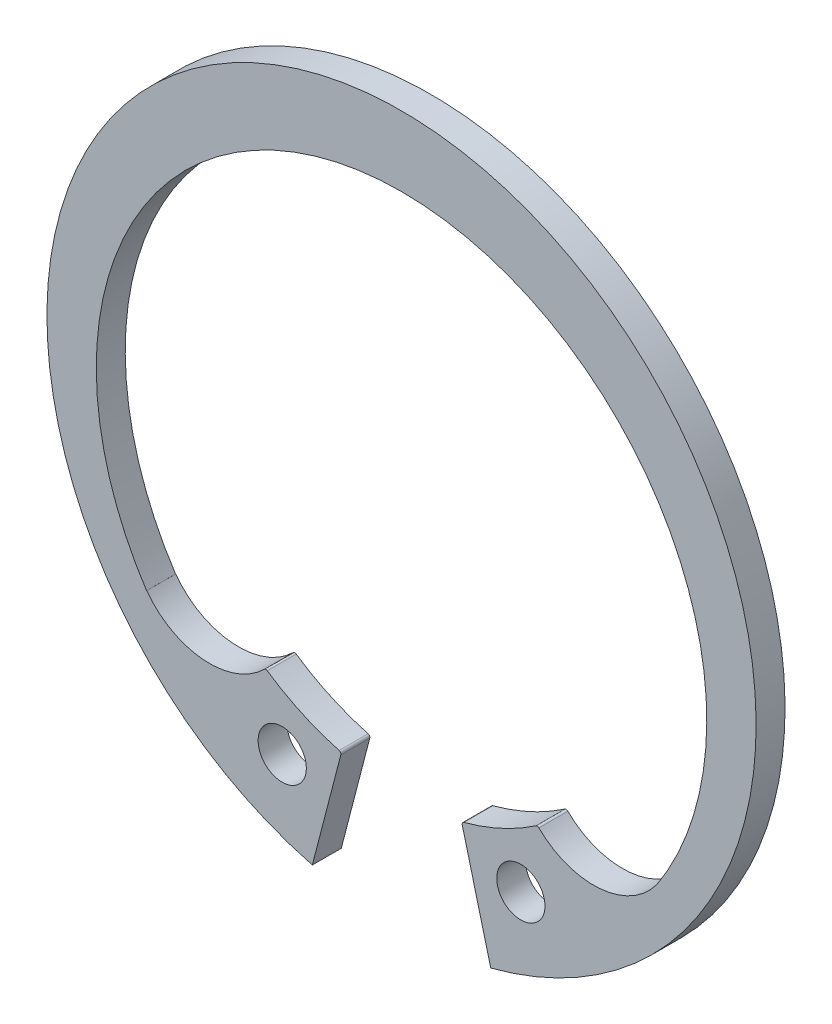
ISO-10303-21;
HEADER;
FILE_DESCRIPTION(('STEP AP214'),'2;1');
FILE_NAME('part.step','',(''),(''),'','','');
FILE_SCHEMA(('AUTOMOTIVE_DESIGN { 1 0 10303 214 1 1 1 1 }'));
ENDSEC;
DATA;
#1=APPLICATION_CONTEXT('core data for automotive mechanical design processes');
#2=APPLICATION_PROTOCOL_DEFINITION('international standard','automotive_design',2000,#1);
#3=PRODUCT_CONTEXT('',#1,'mechanical');
#4=PRODUCT('Part','Part','',(#3));
#5=PRODUCT_RELATED_PRODUCT_CATEGORY('part','',(#4));
#6=PRODUCT_DEFINITION_FORMATION('','',#4);
#7=PRODUCT_DEFINITION_CONTEXT('part definition',#1,'design');
#8=PRODUCT_DEFINITION('design','',#6,#7);
#9=PRODUCT_DEFINITION_SHAPE('','',#8);
#10=(LENGTH_UNIT() NAMED_UNIT(*) SI_UNIT(.MILLI.,.METRE.));
#11=(NAMED_UNIT(*) PLANE_ANGLE_UNIT() SI_UNIT($,.RADIAN.));
#12=(NAMED_UNIT(*) SI_UNIT($,.STERADIAN.) SOLID_ANGLE_UNIT());
#13=UNCERTAINTY_MEASURE_WITH_UNIT(LENGTH_MEASURE(1.E-05),#10,'distance_accuracy_value','');
#14=(GEOMETRIC_REPRESENTATION_CONTEXT(3) GLOBAL_UNCERTAINTY_ASSIGNED_CONTEXT((#13)) GLOBAL_UNIT_ASSIGNED_CONTEXT((#10,
#11,#12)) REPRESENTATION_CONTEXT('',''));
#15=CARTESIAN_POINT('',(0.,0.,0.));
#16=DIRECTION('',(0.,0.,1.));
#17=DIRECTION('',(1.,0.,0.));
#18=AXIS2_PLACEMENT_3D('',#15,#16,#17);
#19=CARTESIAN_POINT('',(0.,0.,-1.2));
#20=DIRECTION('',(0.,0.,1.));
#21=DIRECTION('',(1.,0.,0.));
#22=AXIS2_PLACEMENT_3D('',#19,#20,#21);
#23=CYLINDRICAL_SURFACE('',#22,14.7);
#24=CARTESIAN_POINT('',(0.,0.,-1.2));
#25=DIRECTION('',(0.,0.,1.));
#26=DIRECTION('',(1.,0.,0.));
#27=AXIS2_PLACEMENT_3D('',#24,#25,#26);
#28=CIRCLE('',#27,14.7);
#29=CARTESIAN_POINT('',(3.69832542704428,-14.2271708022248,-1.2));
#30=VERTEX_POINT('',#29);
#31=CARTESIAN_POINT('',(-3.69832542704428,-14.2271708022248,-1.2));
#32=VERTEX_POINT('',#31);
#33=EDGE_CURVE('E150',#30,#32,#28,.T.);
#34=ORIENTED_EDGE('',*,*,#33,.T.);
#35=DIRECTION('',(0.,0.,1.));
#36=VECTOR('',#35,1.);
#37=CARTESIAN_POINT('',(-3.69832542704428,-14.2271708022248,-1.2));
#38=LINE('',#37,#36);
#39=CARTESIAN_POINT('',(-3.69832542704428,-14.2271708022248,0.));
#40=VERTEX_POINT('',#39);
#41=EDGE_CURVE('E40',#32,#40,#38,.T.);
#42=ORIENTED_EDGE('',*,*,#41,.T.);
#43=CARTESIAN_POINT('',(0.,0.,0.));
#44=DIRECTION('',(0.,0.,1.));
#45=DIRECTION('',(1.,0.,0.));
#46=AXIS2_PLACEMENT_3D('',#43,#44,#45);
#47=CIRCLE('',#46,14.7);
#48=CARTESIAN_POINT('',(3.69832542704428,-14.2271708022248,0.));
#49=VERTEX_POINT('',#48);
#50=EDGE_CURVE('E61',#49,#40,#47,.T.);
#51=ORIENTED_EDGE('',*,*,#50,.F.);
#52=DIRECTION('',(0.,0.,1.));
#53=VECTOR('',#52,1.);
#54=CARTESIAN_POINT('',(3.69832542704428,-14.2271708022248,-1.2));
#55=LINE('',#54,#53);
#56=EDGE_CURVE('E11',#30,#49,#55,.T.);
#57=ORIENTED_EDGE('',*,*,#56,.F.);
#58=EDGE_LOOP('',(#34,#42,#51,#57));
#59=FACE_BOUND('',#58,.T.);
#60=ADVANCED_FACE('F37',(#59),#23,.T.);
#61=CARTESIAN_POINT('',(3.69832542704428,-14.2271708022248,-1.2));
#62=DIRECTION('',(-0.967834748450666,-0.251586763744509,0.));
#63=DIRECTION('',(0.251586763744509,-0.967834748450667,0.));
#64=AXIS2_PLACEMENT_3D('',#61,#62,#63);
#65=PLANE('',#64);
#66=DIRECTION('',(0.251586763744509,-0.967834748450666,0.));
#67=VECTOR('',#66,1.);
#68=CARTESIAN_POINT('',(3.69832542704428,-14.2271708022248,0.));
#69=LINE('',#68,#67);
#70=CARTESIAN_POINT('',(2.51574184091822,-9.6778635550339,0.));
#71=VERTEX_POINT('',#70);
#72=EDGE_CURVE('E253',#71,#49,#69,.T.);
#73=ORIENTED_EDGE('',*,*,#72,.F.);
#74=DIRECTION('',(0.,0.,1.));
#75=VECTOR('',#74,1.);
#76=CARTESIAN_POINT('',(2.51574184091822,-9.6778635550339,-1.2));
#77=LINE('',#76,#75);
#78=CARTESIAN_POINT('',(2.51574184091822,-9.6778635550339,-1.2));
#79=VERTEX_POINT('',#78);
#80=EDGE_CURVE('E226',#79,#71,#77,.T.);
#81=ORIENTED_EDGE('',*,*,#80,.F.);
#82=DIRECTION('',(0.251586763744509,-0.967834748450666,0.));
#83=VECTOR('',#82,1.);
#84=CARTESIAN_POINT('',(3.69832542704428,-14.2271708022248,-1.2));
#85=LINE('',#84,#83);
#86=EDGE_CURVE('E256',#79,#30,#85,.T.);
#87=ORIENTED_EDGE('',*,*,#86,.T.);
#88=ORIENTED_EDGE('',*,*,#56,.T.);
#89=EDGE_LOOP('',(#73,#81,#87,#88));
#90=FACE_BOUND('',#89,.T.);
#91=ADVANCED_FACE('F269',(#90),#65,.T.);
#92=CARTESIAN_POINT('',(0.,-0.854718275483989,-1.2));
#93=DIRECTION('',(0.,0.,1.));
#94=DIRECTION('',(1.,0.,0.));
#95=AXIS2_PLACEMENT_3D('',#92,#93,#94);
#96=CYLINDRICAL_SURFACE('',#95,12.654718275484);
#97=DIRECTION('',(0.,0.,1.));
#98=VECTOR('',#97,1.);
#99=CARTESIAN_POINT('',(-10.5686210689552,-7.81504465667515,-1.2));
#100=LINE('',#99,#98);
#101=CARTESIAN_POINT('',(-10.5686210689552,-7.81504465667515,-1.2));
#102=VERTEX_POINT('',#101);
#103=CARTESIAN_POINT('',(-10.5686210689552,-7.81504465667515,0.));
#104=VERTEX_POINT('',#103);
#105=EDGE_CURVE('E191',#102,#104,#100,.T.);
#106=ORIENTED_EDGE('',*,*,#105,.F.);
#107=CARTESIAN_POINT('',(0.,-0.854718275483989,-1.2));
#108=DIRECTION('',(0.,0.,-1.));
#109=DIRECTION('',(1.,0.,0.));
#110=AXIS2_PLACEMENT_3D('',#107,#108,#109);
#111=CIRCLE('',#110,12.654718275484);
#112=CARTESIAN_POINT('',(10.5686210689552,-7.81504465667515,-1.2));
#113=VERTEX_POINT('',#112);
#114=EDGE_CURVE('E69',#102,#113,#111,.T.);
#115=ORIENTED_EDGE('',*,*,#114,.T.);
#116=DIRECTION('',(0.,0.,1.));
#117=VECTOR('',#116,1.);
#118=CARTESIAN_POINT('',(10.5686210689552,-7.81504465667515,-1.2));
#119=LINE('',#118,#117);
#120=CARTESIAN_POINT('',(10.5686210689552,-7.81504465667515,0.));
#121=VERTEX_POINT('',#120);
#122=EDGE_CURVE('E229',#121,#113,#119,.F.);
#123=ORIENTED_EDGE('',*,*,#122,.F.);
#124=CARTESIAN_POINT('',(0.,-0.854718275483989,0.));
#125=DIRECTION('',(0.,0.,-1.));
#126=DIRECTION('',(1.,0.,0.));
#127=AXIS2_PLACEMENT_3D('',#124,#125,#126);
#128=CIRCLE('',#127,12.654718275484);
#129=EDGE_CURVE('E262',#104,#121,#128,.T.);
#130=ORIENTED_EDGE('',*,*,#129,.F.);
#131=EDGE_LOOP('',(#106,#115,#123,#130));
#132=FACE_BOUND('',#131,.T.);
#133=ADVANCED_FACE('F291',(#132),#96,.F.);
#134=CARTESIAN_POINT('',(-3.69832542704428,-14.2271708022248,-1.2));
#135=DIRECTION('',(0.967834748450666,-0.251586763744509,0.));
#136=DIRECTION('',(0.251586763744509,0.967834748450667,0.));
#137=AXIS2_PLACEMENT_3D('',#134,#135,#136);
#138=PLANE('',#137);
#139=DIRECTION('',(0.251586763744509,0.967834748450666,0.));
#140=VECTOR('',#139,1.);
#141=CARTESIAN_POINT('',(-3.69832542704428,-14.2271708022248,0.));
#142=LINE('',#141,#140);
#143=CARTESIAN_POINT('',(-2.51574184091823,-9.6778635550339,0.));
#144=VERTEX_POINT('',#143);
#145=EDGE_CURVE('E260',#40,#144,#142,.T.);
#146=ORIENTED_EDGE('',*,*,#145,.F.);
#147=ORIENTED_EDGE('',*,*,#41,.F.);
#148=DIRECTION('',(0.251586763744509,0.967834748450666,0.));
#149=VECTOR('',#148,1.);
#150=CARTESIAN_POINT('',(-3.69832542704428,-14.2271708022248,-1.2));
#151=LINE('',#150,#149);
#152=CARTESIAN_POINT('',(-2.51574184091823,-9.6778635550339,-1.2));
#153=VERTEX_POINT('',#152);
#154=EDGE_CURVE('E142',#32,#153,#151,.T.);
#155=ORIENTED_EDGE('',*,*,#154,.T.);
#156=DIRECTION('',(0.,0.,1.));
#157=VECTOR('',#156,1.);
#158=CARTESIAN_POINT('',(-2.51574184091823,-9.6778635550339,-1.2));
#159=LINE('',#158,#157);
#160=EDGE_CURVE('E146',#153,#144,#159,.T.);
#161=ORIENTED_EDGE('',*,*,#160,.T.);
#162=EDGE_LOOP('',(#146,#147,#155,#161));
#163=FACE_BOUND('',#162,.T.);
#164=ADVANCED_FACE('F145',(#163),#138,.T.);
#165=CARTESIAN_POINT('',(0.,0.,-1.2));
#166=DIRECTION('',(0.,0.,1.));
#167=DIRECTION('',(1.,0.,0.));
#168=AXIS2_PLACEMENT_3D('',#165,#166,#167);
#169=PLANE('',#168);
#170=ORIENTED_EDGE('',*,*,#114,.F.);
#171=DIRECTION('',(-0.80405047480539,-0.594561043094169,0.));
#172=VECTOR('',#171,1.);
#173=CARTESIAN_POINT('',(-11.8195419796392,-8.74004733348428,-1.2));
#174=LINE('',#173,#172);
#175=CARTESIAN_POINT('',(-10.5634463798531,-7.81121819472204,-1.2));
#176=VERTEX_POINT('',#175);
#177=EDGE_CURVE('E160',#176,#102,#174,.T.);
#178=ORIENTED_EDGE('',*,*,#177,.F.);
#179=CARTESIAN_POINT('',(-7.96009970057336,-5.88615432663227,-1.2));
#180=DIRECTION('',(0.,0.,-1.));
#181=DIRECTION('',(1.,0.,0.));
#182=AXIS2_PLACEMENT_3D('',#179,#180,#181);
#183=CIRCLE('',#182,3.23779011499223);
#184=CARTESIAN_POINT('',(-5.69310927120738,-8.19787213421702,-1.2));
#185=VERTEX_POINT('',#184);
#186=EDGE_CURVE('E177',#185,#176,#183,.T.);
#187=ORIENTED_EDGE('',*,*,#186,.F.);
#188=CARTESIAN_POINT('',(-5.62309267504604,-8.26927014722844,-1.2));
#189=DIRECTION('',(0.,0.,1.));
#190=DIRECTION('',(1.,0.,0.));
#191=AXIS2_PLACEMENT_3D('',#188,#189,#190);
#192=CIRCLE('',#191,0.1);
#193=CARTESIAN_POINT('',(-5.56686174829558,-8.18657744575616,-1.2));
#194=VERTEX_POINT('',#193);
#195=EDGE_CURVE('E169',#194,#185,#192,.T.);
#196=ORIENTED_EDGE('',*,*,#195,.F.);
#197=CARTESIAN_POINT('',(0.,0.,-1.2));
#198=DIRECTION('',(0.,0.,-1.));
#199=DIRECTION('',(1.,0.,0.));
#200=AXIS2_PLACEMENT_3D('',#197,#198,#199);
#201=CIRCLE('',#200,9.9);
#202=CARTESIAN_POINT('',(-2.58640006260566,-9.55617782987285,-1.2));
#203=VERTEX_POINT('',#202);
#204=EDGE_CURVE('E165',#203,#194,#201,.T.);
#205=ORIENTED_EDGE('',*,*,#204,.F.);
#206=CARTESIAN_POINT('',(-2.61252531576329,-9.65270487865945,-1.2));
#207=DIRECTION('',(0.,0.,1.));
#208=DIRECTION('',(-1.,0.,0.));
#209=AXIS2_PLACEMENT_3D('',#206,#207,#208);
#210=CIRCLE('',#209,0.0999999999999995);
#211=EDGE_CURVE('E156',#153,#203,#210,.T.);
#212=ORIENTED_EDGE('',*,*,#211,.F.);
#213=ORIENTED_EDGE('',*,*,#154,.F.);
#214=ORIENTED_EDGE('',*,*,#33,.F.);
#215=ORIENTED_EDGE('',*,*,#86,.F.);
#216=CARTESIAN_POINT('',(2.61252531576329,-9.65270487865945,-1.2));
#217=DIRECTION('',(0.,0.,1.));
#218=DIRECTION('',(1.,0.,0.));
#219=AXIS2_PLACEMENT_3D('',#216,#217,#218);
#220=CIRCLE('',#219,0.0999999999999985);
#221=CARTESIAN_POINT('',(2.58640006260566,-9.55617782987285,-1.2));
#222=VERTEX_POINT('',#221);
#223=EDGE_CURVE('E211',#222,#79,#220,.T.);
#224=ORIENTED_EDGE('',*,*,#223,.F.);
#225=CARTESIAN_POINT('',(0.,0.,-1.2));
#226=DIRECTION('',(0.,0.,-1.));
#227=DIRECTION('',(1.,0.,0.));
#228=AXIS2_PLACEMENT_3D('',#225,#226,#227);
#229=CIRCLE('',#228,9.9);
#230=CARTESIAN_POINT('',(5.56686174829558,-8.18657744575616,-1.2));
#231=VERTEX_POINT('',#230);
#232=EDGE_CURVE('E209',#231,#222,#229,.T.);
#233=ORIENTED_EDGE('',*,*,#232,.F.);
#234=CARTESIAN_POINT('',(5.62309267504604,-8.26927014722844,-1.2));
#235=DIRECTION('',(0.,0.,1.));
#236=DIRECTION('',(-1.,0.,0.));
#237=AXIS2_PLACEMENT_3D('',#234,#235,#236);
#238=CIRCLE('',#237,0.1);
#239=CARTESIAN_POINT('',(5.69310927120738,-8.19787213421702,-1.2));
#240=VERTEX_POINT('',#239);
#241=EDGE_CURVE('E206',#240,#231,#238,.T.);
#242=ORIENTED_EDGE('',*,*,#241,.F.);
#243=CARTESIAN_POINT('',(7.96009970057336,-5.88615432663227,-1.2));
#244=DIRECTION('',(0.,0.,-1.));
#245=DIRECTION('',(1.,0.,0.));
#246=AXIS2_PLACEMENT_3D('',#243,#244,#245);
#247=CIRCLE('',#246,3.23779011499223);
#248=CARTESIAN_POINT('',(10.5634463798531,-7.81121819472204,-1.2));
#249=VERTEX_POINT('',#248);
#250=EDGE_CURVE('E202',#249,#240,#247,.T.);
#251=ORIENTED_EDGE('',*,*,#250,.F.);
#252=DIRECTION('',(-0.80405047480539,0.594561043094169,0.));
#253=VECTOR('',#252,1.);
#254=CARTESIAN_POINT('',(10.5634463798531,-7.81121819472204,-1.2));
#255=LINE('',#254,#253);
#256=EDGE_CURVE('E200',#113,#249,#255,.T.);
#257=ORIENTED_EDGE('',*,*,#256,.F.);
#258=EDGE_LOOP('',(#170,#178,#187,#196,#205,#212,#213,#214,#215,#224,#233,#242,#251,#257));
#259=FACE_BOUND('',#258,.T.);
#260=CARTESIAN_POINT('',(4.94595449661961,-10.8784205708994,-1.2));
#261=DIRECTION('',(0.,0.,1.));
#262=DIRECTION('',(1.,0.,0.));
#263=AXIS2_PLACEMENT_3D('',#260,#261,#262);
#264=CIRCLE('',#263,1.);
#265=CARTESIAN_POINT('',(5.94595449661961,-10.8784205708994,-1.2));
#266=VERTEX_POINT('',#265);
#267=EDGE_CURVE('E248',#266,#266,#264,.T.);
#268=ORIENTED_EDGE('',*,*,#267,.T.);
#269=EDGE_LOOP('',(#268));
#270=FACE_BOUND('',#269,.T.);
#271=CARTESIAN_POINT('',(-4.94595449661961,-10.8784205708994,-1.2));
#272=DIRECTION('',(0.,0.,1.));
#273=DIRECTION('',(1.,0.,0.));
#274=AXIS2_PLACEMENT_3D('',#271,#272,#273);
#275=CIRCLE('',#274,1.);
#276=CARTESIAN_POINT('',(-3.94595449661961,-10.8784205708994,-1.2));
#277=VERTEX_POINT('',#276);
#278=EDGE_CURVE('E242',#277,#277,#275,.T.);
#279=ORIENTED_EDGE('',*,*,#278,.T.);
#280=EDGE_LOOP('',(#279));
#281=FACE_BOUND('',#280,.T.);
#282=ADVANCED_FACE('F162',(#259,#270,#281),#169,.F.);
#283=CARTESIAN_POINT('',(0.,0.,0.));
#284=DIRECTION('',(0.,0.,1.));
#285=DIRECTION('',(1.,0.,0.));
#286=AXIS2_PLACEMENT_3D('',#283,#284,#285);
#287=PLANE('',#286);
#288=DIRECTION('',(-0.80405047480539,-0.594561043094169,0.));
#289=VECTOR('',#288,1.);
#290=CARTESIAN_POINT('',(-11.8195419796392,-8.74004733348428,0.));
#291=LINE('',#290,#289);
#292=CARTESIAN_POINT('',(-10.5634463798531,-7.81121819472204,0.));
#293=VERTEX_POINT('',#292);
#294=EDGE_CURVE('E167',#293,#104,#291,.T.);
#295=ORIENTED_EDGE('',*,*,#294,.T.);
#296=ORIENTED_EDGE('',*,*,#129,.T.);
#297=DIRECTION('',(-0.80405047480539,0.594561043094169,0.));
#298=VECTOR('',#297,1.);
#299=CARTESIAN_POINT('',(10.5634463798531,-7.81121819472204,0.));
#300=LINE('',#299,#298);
#301=CARTESIAN_POINT('',(10.5634463798531,-7.81121819472204,0.));
#302=VERTEX_POINT('',#301);
#303=EDGE_CURVE('E199',#121,#302,#300,.T.);
#304=ORIENTED_EDGE('',*,*,#303,.T.);
#305=CARTESIAN_POINT('',(7.96009970057336,-5.88615432663227,0.));
#306=DIRECTION('',(0.,0.,-1.));
#307=DIRECTION('',(1.,0.,0.));
#308=AXIS2_PLACEMENT_3D('',#305,#306,#307);
#309=CIRCLE('',#308,3.23779011499223);
#310=CARTESIAN_POINT('',(5.69310927120738,-8.19787213421702,0.));
#311=VERTEX_POINT('',#310);
#312=EDGE_CURVE('E216',#302,#311,#309,.T.);
#313=ORIENTED_EDGE('',*,*,#312,.T.);
#314=CARTESIAN_POINT('',(5.62309267504604,-8.26927014722844,0.));
#315=DIRECTION('',(0.,0.,1.));
#316=DIRECTION('',(-1.,0.,0.));
#317=AXIS2_PLACEMENT_3D('',#314,#315,#316);
#318=CIRCLE('',#317,0.1);
#319=CARTESIAN_POINT('',(5.56686174829558,-8.18657744575616,0.));
#320=VERTEX_POINT('',#319);
#321=EDGE_CURVE('E219',#311,#320,#318,.T.);
#322=ORIENTED_EDGE('',*,*,#321,.T.);
#323=CARTESIAN_POINT('',(0.,0.,0.));
#324=DIRECTION('',(0.,0.,-1.));
#325=DIRECTION('',(1.,0.,0.));
#326=AXIS2_PLACEMENT_3D('',#323,#324,#325);
#327=CIRCLE('',#326,9.9);
#328=CARTESIAN_POINT('',(2.58640006260566,-9.55617782987285,0.));
#329=VERTEX_POINT('',#328);
#330=EDGE_CURVE('E222',#320,#329,#327,.T.);
#331=ORIENTED_EDGE('',*,*,#330,.T.);
#332=CARTESIAN_POINT('',(2.61252531576329,-9.65270487865945,0.));
#333=DIRECTION('',(0.,0.,1.));
#334=DIRECTION('',(1.,0.,0.));
#335=AXIS2_PLACEMENT_3D('',#332,#333,#334);
#336=CIRCLE('',#335,0.0999999999999985);
#337=EDGE_CURVE('E203',#329,#71,#336,.T.);
#338=ORIENTED_EDGE('',*,*,#337,.T.);
#339=ORIENTED_EDGE('',*,*,#72,.T.);
#340=ORIENTED_EDGE('',*,*,#50,.T.);
#341=ORIENTED_EDGE('',*,*,#145,.T.);
#342=CARTESIAN_POINT('',(-2.61252531576329,-9.65270487865945,0.));
#343=DIRECTION('',(0.,0.,1.));
#344=DIRECTION('',(-1.,0.,0.));
#345=AXIS2_PLACEMENT_3D('',#342,#343,#344);
#346=CIRCLE('',#345,0.0999999999999995);
#347=CARTESIAN_POINT('',(-2.58640006260566,-9.55617782987285,0.));
#348=VERTEX_POINT('',#347);
#349=EDGE_CURVE('E158',#144,#348,#346,.T.);
#350=ORIENTED_EDGE('',*,*,#349,.T.);
#351=CARTESIAN_POINT('',(0.,0.,0.));
#352=DIRECTION('',(0.,0.,-1.));
#353=DIRECTION('',(1.,0.,0.));
#354=AXIS2_PLACEMENT_3D('',#351,#352,#353);
#355=CIRCLE('',#354,9.9);
#356=CARTESIAN_POINT('',(-5.56686174829558,-8.18657744575616,0.));
#357=VERTEX_POINT('',#356);
#358=EDGE_CURVE('E182',#348,#357,#355,.T.);
#359=ORIENTED_EDGE('',*,*,#358,.T.);
#360=CARTESIAN_POINT('',(-5.62309267504604,-8.26927014722844,0.));
#361=DIRECTION('',(0.,0.,1.));
#362=DIRECTION('',(1.,0.,0.));
#363=AXIS2_PLACEMENT_3D('',#360,#361,#362);
#364=CIRCLE('',#363,0.1);
#365=CARTESIAN_POINT('',(-5.69310927120738,-8.19787213421702,0.));
#366=VERTEX_POINT('',#365);
#367=EDGE_CURVE('E184',#357,#366,#364,.T.);
#368=ORIENTED_EDGE('',*,*,#367,.T.);
#369=CARTESIAN_POINT('',(-7.96009970057336,-5.88615432663227,0.));
#370=DIRECTION('',(0.,0.,-1.));
#371=DIRECTION('',(1.,0.,0.));
#372=AXIS2_PLACEMENT_3D('',#369,#370,#371);
#373=CIRCLE('',#372,3.23779011499223);
#374=EDGE_CURVE('E172',#366,#293,#373,.T.);
#375=ORIENTED_EDGE('',*,*,#374,.T.);
#376=EDGE_LOOP('',(#295,#296,#304,#313,#322,#331,#338,#339,#340,#341,#350,#359,#368,#375));
#377=FACE_BOUND('',#376,.T.);
#378=CARTESIAN_POINT('',(4.94595449661961,-10.8784205708994,0.));
#379=DIRECTION('',(0.,0.,1.));
#380=DIRECTION('',(1.,0.,0.));
#381=AXIS2_PLACEMENT_3D('',#378,#379,#380);
#382=CIRCLE('',#381,1.);
#383=CARTESIAN_POINT('',(5.94595449661961,-10.8784205708994,0.));
#384=VERTEX_POINT('',#383);
#385=EDGE_CURVE('E245',#384,#384,#382,.T.);
#386=ORIENTED_EDGE('',*,*,#385,.F.);
#387=EDGE_LOOP('',(#386));
#388=FACE_BOUND('',#387,.T.);
#389=CARTESIAN_POINT('',(-4.94595449661961,-10.8784205708994,0.));
#390=DIRECTION('',(0.,0.,1.));
#391=DIRECTION('',(1.,0.,0.));
#392=AXIS2_PLACEMENT_3D('',#389,#390,#391);
#393=CIRCLE('',#392,1.);
#394=CARTESIAN_POINT('',(-3.94595449661961,-10.8784205708994,0.));
#395=VERTEX_POINT('',#394);
#396=EDGE_CURVE('E241',#395,#395,#393,.T.);
#397=ORIENTED_EDGE('',*,*,#396,.F.);
#398=EDGE_LOOP('',(#397));
#399=FACE_BOUND('',#398,.T.);
#400=ADVANCED_FACE('F264',(#377,#388,#399),#287,.T.);
#401=CARTESIAN_POINT('',(4.94595449661961,-10.8784205708994,-1.2));
#402=DIRECTION('',(0.,0.,1.));
#403=DIRECTION('',(1.,0.,0.));
#404=AXIS2_PLACEMENT_3D('',#401,#402,#403);
#405=CYLINDRICAL_SURFACE('',#404,1.);
#406=ORIENTED_EDGE('',*,*,#267,.F.);
#407=EDGE_LOOP('',(#406));
#408=FACE_BOUND('',#407,.T.);
#409=ORIENTED_EDGE('',*,*,#385,.T.);
#410=EDGE_LOOP('',(#409));
#411=FACE_BOUND('',#410,.T.);
#412=ADVANCED_FACE('F314',(#408,#411),#405,.F.);
#413=CARTESIAN_POINT('',(-4.94595449661961,-10.8784205708994,-1.2));
#414=DIRECTION('',(0.,0.,1.));
#415=DIRECTION('',(1.,0.,0.));
#416=AXIS2_PLACEMENT_3D('',#413,#414,#415);
#417=CYLINDRICAL_SURFACE('',#416,1.);
#418=ORIENTED_EDGE('',*,*,#278,.F.);
#419=EDGE_LOOP('',(#418));
#420=FACE_BOUND('',#419,.T.);
#421=ORIENTED_EDGE('',*,*,#396,.T.);
#422=EDGE_LOOP('',(#421));
#423=FACE_BOUND('',#422,.T.);
#424=ADVANCED_FACE('F307',(#420,#423),#417,.F.);
#425=CARTESIAN_POINT('',(0.,0.,-1.2));
#426=DIRECTION('',(0.,0.,1.));
#427=DIRECTION('',(1.,0.,0.));
#428=AXIS2_PLACEMENT_3D('',#425,#426,#427);
#429=CYLINDRICAL_SURFACE('',#428,9.9);
#430=ORIENTED_EDGE('',*,*,#330,.F.);
#431=DIRECTION('',(0.,0.,1.));
#432=VECTOR('',#431,1.);
#433=CARTESIAN_POINT('',(5.56686174829558,-8.18657744575616,-1.2));
#434=LINE('',#433,#432);
#435=EDGE_CURVE('E233',#231,#320,#434,.T.);
#436=ORIENTED_EDGE('',*,*,#435,.F.);
#437=ORIENTED_EDGE('',*,*,#232,.T.);
#438=DIRECTION('',(0.,0.,1.));
#439=VECTOR('',#438,1.);
#440=CARTESIAN_POINT('',(2.58640006260566,-9.55617782987285,-1.2));
#441=LINE('',#440,#439);
#442=EDGE_CURVE('E230',#222,#329,#441,.T.);
#443=ORIENTED_EDGE('',*,*,#442,.T.);
#444=EDGE_LOOP('',(#430,#436,#437,#443));
#445=FACE_BOUND('',#444,.T.);
#446=ADVANCED_FACE('F305',(#445),#429,.F.);
#447=CARTESIAN_POINT('',(2.61252531576329,-9.65270487865945,-1.2));
#448=DIRECTION('',(0.,0.,1.));
#449=DIRECTION('',(1.,0.,0.));
#450=AXIS2_PLACEMENT_3D('',#447,#448,#449);
#451=CYLINDRICAL_SURFACE('',#450,0.0999999999999985);
#452=ORIENTED_EDGE('',*,*,#337,.F.);
#453=ORIENTED_EDGE('',*,*,#442,.F.);
#454=ORIENTED_EDGE('',*,*,#223,.T.);
#455=ORIENTED_EDGE('',*,*,#80,.T.);
#456=EDGE_LOOP('',(#452,#453,#454,#455));
#457=FACE_BOUND('',#456,.T.);
#458=ADVANCED_FACE('F271',(#457),#451,.T.);
#459=CARTESIAN_POINT('',(5.62309267504604,-8.26927014722844,-1.2));
#460=DIRECTION('',(0.,0.,1.));
#461=DIRECTION('',(1.,0.,0.));
#462=AXIS2_PLACEMENT_3D('',#459,#460,#461);
#463=CYLINDRICAL_SURFACE('',#462,0.1);
#464=ORIENTED_EDGE('',*,*,#321,.F.);
#465=DIRECTION('',(0.,0.,1.));
#466=VECTOR('',#465,1.);
#467=CARTESIAN_POINT('',(5.69310927120738,-8.19787213421702,-1.2));
#468=LINE('',#467,#466);
#469=EDGE_CURVE('E236',#240,#311,#468,.T.);
#470=ORIENTED_EDGE('',*,*,#469,.F.);
#471=ORIENTED_EDGE('',*,*,#241,.T.);
#472=ORIENTED_EDGE('',*,*,#435,.T.);
#473=EDGE_LOOP('',(#464,#470,#471,#472));
#474=FACE_BOUND('',#473,.T.);
#475=ADVANCED_FACE('F303',(#474),#463,.T.);
#476=CARTESIAN_POINT('',(7.96009970057336,-5.88615432663227,-1.2));
#477=DIRECTION('',(0.,0.,1.));
#478=DIRECTION('',(1.,0.,0.));
#479=AXIS2_PLACEMENT_3D('',#476,#477,#478);
#480=CYLINDRICAL_SURFACE('',#479,3.23779011499223);
#481=ORIENTED_EDGE('',*,*,#312,.F.);
#482=DIRECTION('',(0.,0.,1.));
#483=VECTOR('',#482,1.);
#484=CARTESIAN_POINT('',(10.5634463798531,-7.81121819472204,-1.2));
#485=LINE('',#484,#483);
#486=EDGE_CURVE('E214',#249,#302,#485,.T.);
#487=ORIENTED_EDGE('',*,*,#486,.F.);
#488=ORIENTED_EDGE('',*,*,#250,.T.);
#489=ORIENTED_EDGE('',*,*,#469,.T.);
#490=EDGE_LOOP('',(#481,#487,#488,#489));
#491=FACE_BOUND('',#490,.T.);
#492=ADVANCED_FACE('F300',(#491),#480,.F.);
#493=CARTESIAN_POINT('',(10.5634463798531,-7.81121819472204,-1.2));
#494=DIRECTION('',(0.594561043094169,0.80405047480539,0.));
#495=DIRECTION('',(-0.80405047480539,0.594561043094169,0.));
#496=AXIS2_PLACEMENT_3D('',#493,#494,#495);
#497=PLANE('',#496);
#498=ORIENTED_EDGE('',*,*,#303,.F.);
#499=ORIENTED_EDGE('',*,*,#122,.T.);
#500=ORIENTED_EDGE('',*,*,#256,.T.);
#501=ORIENTED_EDGE('',*,*,#486,.T.);
#502=EDGE_LOOP('',(#498,#499,#500,#501));
#503=FACE_BOUND('',#502,.T.);
#504=ADVANCED_FACE('F297',(#503),#497,.T.);
#505=CARTESIAN_POINT('',(0.,0.,-1.2));
#506=DIRECTION('',(0.,0.,1.));
#507=DIRECTION('',(1.,0.,0.));
#508=AXIS2_PLACEMENT_3D('',#505,#506,#507);
#509=CYLINDRICAL_SURFACE('',#508,9.9);
#510=ORIENTED_EDGE('',*,*,#358,.F.);
#511=DIRECTION('',(0.,0.,1.));
#512=VECTOR('',#511,1.);
#513=CARTESIAN_POINT('',(-2.58640006260566,-9.55617782987285,-1.2));
#514=LINE('',#513,#512);
#515=EDGE_CURVE('E159',#203,#348,#514,.T.);
#516=ORIENTED_EDGE('',*,*,#515,.F.);
#517=ORIENTED_EDGE('',*,*,#204,.T.);
#518=DIRECTION('',(0.,0.,1.));
#519=VECTOR('',#518,1.);
#520=CARTESIAN_POINT('',(-5.56686174829558,-8.18657744575616,-1.2));
#521=LINE('',#520,#519);
#522=EDGE_CURVE('E194',#194,#357,#521,.T.);
#523=ORIENTED_EDGE('',*,*,#522,.T.);
#524=EDGE_LOOP('',(#510,#516,#517,#523));
#525=FACE_BOUND('',#524,.T.);
#526=ADVANCED_FACE('F279',(#525),#509,.F.);
#527=CARTESIAN_POINT('',(-11.8195419796392,-8.74004733348428,-1.2));
#528=DIRECTION('',(-0.594561043094169,0.80405047480539,0.));
#529=DIRECTION('',(-0.80405047480539,-0.594561043094169,0.));
#530=AXIS2_PLACEMENT_3D('',#527,#528,#529);
#531=PLANE('',#530);
#532=ORIENTED_EDGE('',*,*,#177,.T.);
#533=ORIENTED_EDGE('',*,*,#105,.T.);
#534=ORIENTED_EDGE('',*,*,#294,.F.);
#535=DIRECTION('',(0.,0.,1.));
#536=VECTOR('',#535,1.);
#537=CARTESIAN_POINT('',(-10.5634463798531,-7.81121819472204,-1.2));
#538=LINE('',#537,#536);
#539=EDGE_CURVE('E189',#176,#293,#538,.T.);
#540=ORIENTED_EDGE('',*,*,#539,.F.);
#541=EDGE_LOOP('',(#532,#533,#534,#540));
#542=FACE_BOUND('',#541,.T.);
#543=ADVANCED_FACE('F289',(#542),#531,.T.);
#544=CARTESIAN_POINT('',(-7.96009970057336,-5.88615432663227,-1.2));
#545=DIRECTION('',(0.,0.,1.));
#546=DIRECTION('',(1.,0.,0.));
#547=AXIS2_PLACEMENT_3D('',#544,#545,#546);
#548=CYLINDRICAL_SURFACE('',#547,3.23779011499223);
#549=ORIENTED_EDGE('',*,*,#374,.F.);
#550=DIRECTION('',(0.,0.,1.));
#551=VECTOR('',#550,1.);
#552=CARTESIAN_POINT('',(-5.69310927120738,-8.19787213421702,-1.2));
#553=LINE('',#552,#551);
#554=EDGE_CURVE('E192',#185,#366,#553,.T.);
#555=ORIENTED_EDGE('',*,*,#554,.F.);
#556=ORIENTED_EDGE('',*,*,#186,.T.);
#557=ORIENTED_EDGE('',*,*,#539,.T.);
#558=EDGE_LOOP('',(#549,#555,#556,#557));
#559=FACE_BOUND('',#558,.T.);
#560=ADVANCED_FACE('F285',(#559),#548,.F.);
#561=CARTESIAN_POINT('',(-5.62309267504604,-8.26927014722844,-1.2));
#562=DIRECTION('',(0.,0.,1.));
#563=DIRECTION('',(1.,0.,0.));
#564=AXIS2_PLACEMENT_3D('',#561,#562,#563);
#565=CYLINDRICAL_SURFACE('',#564,0.1);
#566=ORIENTED_EDGE('',*,*,#367,.F.);
#567=ORIENTED_EDGE('',*,*,#522,.F.);
#568=ORIENTED_EDGE('',*,*,#195,.T.);
#569=ORIENTED_EDGE('',*,*,#554,.T.);
#570=EDGE_LOOP('',(#566,#567,#568,#569));
#571=FACE_BOUND('',#570,.T.);
#572=ADVANCED_FACE('F281',(#571),#565,.T.);
#573=CARTESIAN_POINT('',(-2.61252531576329,-9.65270487865945,-1.2));
#574=DIRECTION('',(0.,0.,1.));
#575=DIRECTION('',(1.,0.,0.));
#576=AXIS2_PLACEMENT_3D('',#573,#574,#575);
#577=CYLINDRICAL_SURFACE('',#576,0.0999999999999995);
#578=ORIENTED_EDGE('',*,*,#349,.F.);
#579=ORIENTED_EDGE('',*,*,#160,.F.);
#580=ORIENTED_EDGE('',*,*,#211,.T.);
#581=ORIENTED_EDGE('',*,*,#515,.T.);
#582=EDGE_LOOP('',(#578,#579,#580,#581));
#583=FACE_BOUND('',#582,.T.);
#584=ADVANCED_FACE('F154',(#583),#577,.T.);
#585=CLOSED_SHELL('',(#60,#91,#133,#164,#282,#400,#412,#424,#446,#458,#475,#492,#504,#526,#543,
#560,#572,#584));
#586=MANIFOLD_SOLID_BREP('B2',#585);
#587=ADVANCED_BREP_SHAPE_REPRESENTATION('',(#18,#586),#14);
#588=SHAPE_DEFINITION_REPRESENTATION(#9,#587);
ENDSEC;
END-ISO-10303-21;
